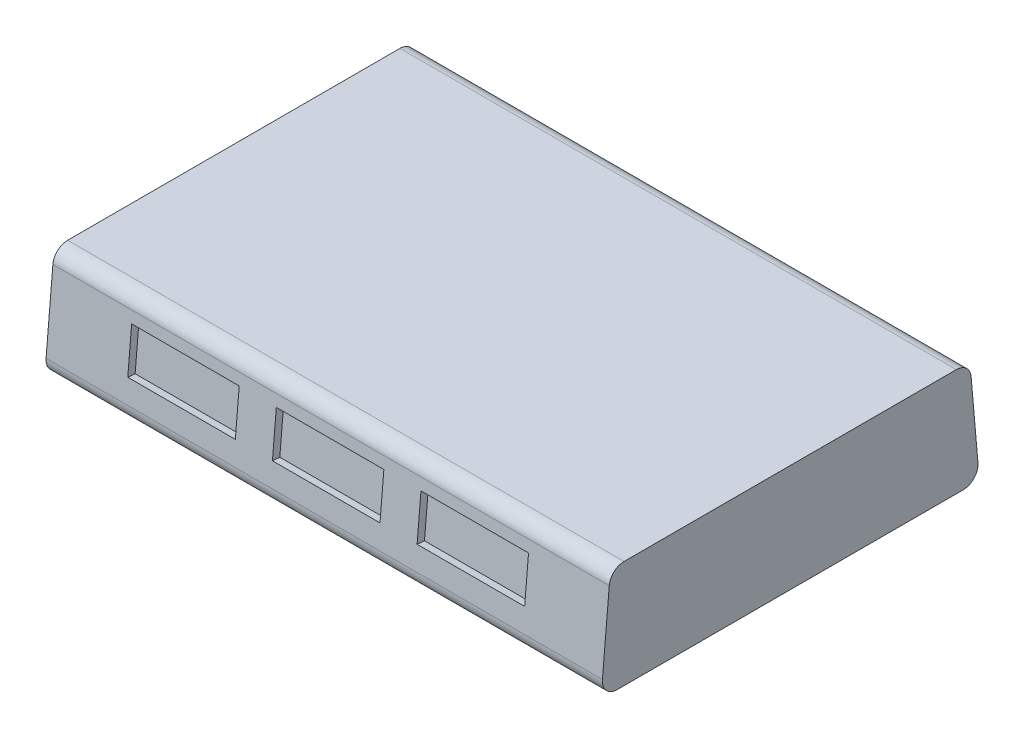
ISO-10303-21;
HEADER;
FILE_DESCRIPTION(('STEP AP214'),'2;1');
FILE_NAME('part.step','',(''),(''),'','','');
FILE_SCHEMA(('AUTOMOTIVE_DESIGN { 1 0 10303 214 1 1 1 1 }'));
ENDSEC;
DATA;
#1=APPLICATION_CONTEXT('core data for automotive mechanical design processes');
#2=APPLICATION_PROTOCOL_DEFINITION('international standard','automotive_design',2000,#1);
#3=PRODUCT_CONTEXT('',#1,'mechanical');
#4=PRODUCT('Part','Part','',(#3));
#5=PRODUCT_RELATED_PRODUCT_CATEGORY('part','',(#4));
#6=PRODUCT_DEFINITION_FORMATION('','',#4);
#7=PRODUCT_DEFINITION_CONTEXT('part definition',#1,'design');
#8=PRODUCT_DEFINITION('design','',#6,#7);
#9=PRODUCT_DEFINITION_SHAPE('','',#8);
#10=(LENGTH_UNIT() NAMED_UNIT(*) SI_UNIT(.MILLI.,.METRE.));
#11=(NAMED_UNIT(*) PLANE_ANGLE_UNIT() SI_UNIT($,.RADIAN.));
#12=(NAMED_UNIT(*) SI_UNIT($,.STERADIAN.) SOLID_ANGLE_UNIT());
#13=UNCERTAINTY_MEASURE_WITH_UNIT(LENGTH_MEASURE(1.E-05),#10,'distance_accuracy_value','');
#14=(GEOMETRIC_REPRESENTATION_CONTEXT(3) GLOBAL_UNCERTAINTY_ASSIGNED_CONTEXT((#13)) GLOBAL_UNIT_ASSIGNED_CONTEXT((#10,
#11,#12)) REPRESENTATION_CONTEXT('',''));
#15=CARTESIAN_POINT('',(0.,0.,0.));
#16=DIRECTION('',(0.,0.,1.));
#17=DIRECTION('',(1.,0.,0.));
#18=AXIS2_PLACEMENT_3D('',#15,#16,#17);
#19=CARTESIAN_POINT('',(37.5,5.24999999999999,-22.3987520308393));
#20=DIRECTION('',(-1.,0.,0.));
#21=DIRECTION('',(0.,0.,1.));
#22=AXIS2_PLACEMENT_3D('',#19,#20,#21);
#23=CYLINDRICAL_SURFACE('',#22,2.);
#24=CARTESIAN_POINT('',(-37.5,5.24999999999999,-22.3987520308393));
#25=DIRECTION('',(1.,0.,0.));
#26=DIRECTION('',(0.,0.,-1.));
#27=AXIS2_PLACEMENT_3D('',#24,#25,#26);
#28=CIRCLE('',#27,2.);
#29=CARTESIAN_POINT('',(-37.5,5.42431148549529,-24.3911414270228));
#30=VERTEX_POINT('',#29);
#31=CARTESIAN_POINT('',(-37.5,7.24999999999999,-22.3987520308393));
#32=VERTEX_POINT('',#31);
#33=EDGE_CURVE('E318',#30,#32,#28,.T.);
#34=ORIENTED_EDGE('',*,*,#33,.T.);
#35=DIRECTION('',(-1.,0.,0.));
#36=VECTOR('',#35,1.);
#37=CARTESIAN_POINT('',(37.5,7.24999999999999,-22.3987520308393));
#38=LINE('',#37,#36);
#39=CARTESIAN_POINT('',(37.5,7.24999999999999,-22.3987520308393));
#40=VERTEX_POINT('',#39);
#41=EDGE_CURVE('E11',#40,#32,#38,.T.);
#42=ORIENTED_EDGE('',*,*,#41,.F.);
#43=CARTESIAN_POINT('',(37.5,5.24999999999999,-22.3987520308393));
#44=DIRECTION('',(1.,0.,0.));
#45=DIRECTION('',(0.,0.,-1.));
#46=AXIS2_PLACEMENT_3D('',#43,#44,#45);
#47=CIRCLE('',#46,2.);
#48=CARTESIAN_POINT('',(37.5,5.42431148549529,-24.3911414270228));
#49=VERTEX_POINT('',#48);
#50=EDGE_CURVE('E387',#49,#40,#47,.T.);
#51=ORIENTED_EDGE('',*,*,#50,.F.);
#52=DIRECTION('',(-1.,0.,0.));
#53=VECTOR('',#52,1.);
#54=CARTESIAN_POINT('',(37.5,5.42431148549529,-24.3911414270228));
#55=LINE('',#54,#53);
#56=EDGE_CURVE('E405',#49,#30,#55,.T.);
#57=ORIENTED_EDGE('',*,*,#56,.T.);
#58=EDGE_LOOP('',(#34,#42,#51,#57));
#59=FACE_BOUND('',#58,.T.);
#60=ADVANCED_FACE('F38',(#59),#23,.T.);
#61=CARTESIAN_POINT('',(37.5,7.24999999999999,-22.3987520308393));
#62=DIRECTION('',(0.,-1.,0.));
#63=DIRECTION('',(0.,0.,-1.));
#64=AXIS2_PLACEMENT_3D('',#61,#62,#63);
#65=PLANE('',#64);
#66=DIRECTION('',(0.,0.,1.));
#67=VECTOR('',#66,1.);
#68=CARTESIAN_POINT('',(-37.5,7.24999999999999,-22.3987520308393));
#69=LINE('',#68,#67);
#70=CARTESIAN_POINT('',(-37.5,7.24999999999999,22.3987520308393));
#71=VERTEX_POINT('',#70);
#72=EDGE_CURVE('E408',#32,#71,#69,.T.);
#73=ORIENTED_EDGE('',*,*,#72,.T.);
#74=DIRECTION('',(-1.,0.,0.));
#75=VECTOR('',#74,1.);
#76=CARTESIAN_POINT('',(37.5,7.24999999999999,22.3987520308393));
#77=LINE('',#76,#75);
#78=CARTESIAN_POINT('',(37.5,7.24999999999999,22.3987520308393));
#79=VERTEX_POINT('',#78);
#80=EDGE_CURVE('E45',#79,#71,#77,.T.);
#81=ORIENTED_EDGE('',*,*,#80,.F.);
#82=DIRECTION('',(0.,0.,1.));
#83=VECTOR('',#82,1.);
#84=CARTESIAN_POINT('',(37.5,7.24999999999999,-22.3987520308393));
#85=LINE('',#84,#83);
#86=EDGE_CURVE('E390',#40,#79,#85,.T.);
#87=ORIENTED_EDGE('',*,*,#86,.F.);
#88=ORIENTED_EDGE('',*,*,#41,.T.);
#89=EDGE_LOOP('',(#73,#81,#87,#88));
#90=FACE_BOUND('',#89,.T.);
#91=ADVANCED_FACE('F465',(#90),#65,.F.);
#92=CARTESIAN_POINT('',(37.5,5.24999999999999,22.3987520308393));
#93=DIRECTION('',(-1.,0.,0.));
#94=DIRECTION('',(0.,0.,1.));
#95=AXIS2_PLACEMENT_3D('',#92,#93,#94);
#96=CYLINDRICAL_SURFACE('',#95,2.);
#97=CARTESIAN_POINT('',(-37.5,5.24999999999999,22.3987520308393));
#98=DIRECTION('',(1.,0.,0.));
#99=DIRECTION('',(0.,0.,1.));
#100=AXIS2_PLACEMENT_3D('',#97,#98,#99);
#101=CIRCLE('',#100,2.);
#102=CARTESIAN_POINT('',(-37.5,5.42431148549529,24.3911414270228));
#103=VERTEX_POINT('',#102);
#104=EDGE_CURVE('E410',#71,#103,#101,.T.);
#105=ORIENTED_EDGE('',*,*,#104,.T.);
#106=DIRECTION('',(-1.,0.,0.));
#107=VECTOR('',#106,1.);
#108=CARTESIAN_POINT('',(37.5,5.42431148549529,24.3911414270228));
#109=LINE('',#108,#107);
#110=CARTESIAN_POINT('',(37.5,5.42431148549529,24.3911414270228));
#111=VERTEX_POINT('',#110);
#112=EDGE_CURVE('E435',#111,#103,#109,.T.);
#113=ORIENTED_EDGE('',*,*,#112,.F.);
#114=CARTESIAN_POINT('',(37.5,5.24999999999999,22.3987520308393));
#115=DIRECTION('',(1.,0.,0.));
#116=DIRECTION('',(0.,0.,1.));
#117=AXIS2_PLACEMENT_3D('',#114,#115,#116);
#118=CIRCLE('',#117,2.);
#119=EDGE_CURVE('E393',#79,#111,#118,.T.);
#120=ORIENTED_EDGE('',*,*,#119,.F.);
#121=ORIENTED_EDGE('',*,*,#80,.T.);
#122=EDGE_LOOP('',(#105,#113,#120,#121));
#123=FACE_BOUND('',#122,.T.);
#124=ADVANCED_FACE('F442',(#123),#96,.T.);
#125=CARTESIAN_POINT('',(37.5,5.42431148549529,24.3911414270228));
#126=DIRECTION('',(0.,-0.0871557427476516,-0.996194698091746));
#127=DIRECTION('',(0.,0.996194698091746,-0.0871557427476516));
#128=AXIS2_PLACEMENT_3D('',#125,#126,#127);
#129=PLANE('',#128);
#130=DIRECTION('',(1.,0.,0.));
#131=VECTOR('',#130,1.);
#132=CARTESIAN_POINT('',(-26.75,-2.0471487501928,25.0448094976302));
#133=LINE('',#132,#131);
#134=CARTESIAN_POINT('',(-26.75,-2.0471487501928,25.0448094976302));
#135=VERTEX_POINT('',#134);
#136=CARTESIAN_POINT('',(-12.25,-2.0471487501928,25.0448094976302));
#137=VERTEX_POINT('',#136);
#138=EDGE_CURVE('E307',#135,#137,#133,.T.);
#139=ORIENTED_EDGE('',*,*,#138,.F.);
#140=DIRECTION('',(0.,-0.996194698091746,0.0871557427476518));
#141=VECTOR('',#140,1.);
#142=CARTESIAN_POINT('',(-26.75,3.93001943835767,24.5218750411443));
#143=LINE('',#142,#141);
#144=CARTESIAN_POINT('',(-26.75,3.93001943835767,24.5218750411443));
#145=VERTEX_POINT('',#144);
#146=EDGE_CURVE('E305',#145,#135,#143,.T.);
#147=ORIENTED_EDGE('',*,*,#146,.F.);
#148=DIRECTION('',(-1.,0.,0.));
#149=VECTOR('',#148,1.);
#150=CARTESIAN_POINT('',(-26.75,3.93001943835767,24.5218750411443));
#151=LINE('',#150,#149);
#152=CARTESIAN_POINT('',(-12.25,3.93001943835767,24.5218750411443));
#153=VERTEX_POINT('',#152);
#154=EDGE_CURVE('E295',#153,#145,#151,.T.);
#155=ORIENTED_EDGE('',*,*,#154,.F.);
#156=DIRECTION('',(0.,0.996194698091746,-0.0871557427476518));
#157=VECTOR('',#156,1.);
#158=CARTESIAN_POINT('',(-12.25,3.93001943835767,24.5218750411443));
#159=LINE('',#158,#157);
#160=EDGE_CURVE('E311',#137,#153,#159,.T.);
#161=ORIENTED_EDGE('',*,*,#160,.F.);
#162=EDGE_LOOP('',(#139,#147,#155,#161));
#163=FACE_BOUND('',#162,.T.);
#164=DIRECTION('',(1.,0.,0.));
#165=VECTOR('',#164,1.);
#166=CARTESIAN_POINT('',(-7.25,-2.0471487501928,25.0448094976302));
#167=LINE('',#166,#165);
#168=CARTESIAN_POINT('',(-7.25,-2.0471487501928,25.0448094976302));
#169=VERTEX_POINT('',#168);
#170=CARTESIAN_POINT('',(7.25,-2.0471487501928,25.0448094976302));
#171=VERTEX_POINT('',#170);
#172=EDGE_CURVE('E341',#169,#171,#167,.T.);
#173=ORIENTED_EDGE('',*,*,#172,.F.);
#174=DIRECTION('',(0.,-0.996194698091746,0.0871557427476518));
#175=VECTOR('',#174,1.);
#176=CARTESIAN_POINT('',(-7.25,3.93001943835767,24.5218750411443));
#177=LINE('',#176,#175);
#178=CARTESIAN_POINT('',(-7.25,3.93001943835767,24.5218750411443));
#179=VERTEX_POINT('',#178);
#180=EDGE_CURVE('E339',#179,#169,#177,.T.);
#181=ORIENTED_EDGE('',*,*,#180,.F.);
#182=DIRECTION('',(-1.,0.,0.));
#183=VECTOR('',#182,1.);
#184=CARTESIAN_POINT('',(-7.25,3.93001943835767,24.5218750411443));
#185=LINE('',#184,#183);
#186=CARTESIAN_POINT('',(7.25,3.93001943835767,24.5218750411443));
#187=VERTEX_POINT('',#186);
#188=EDGE_CURVE('E329',#187,#179,#185,.T.);
#189=ORIENTED_EDGE('',*,*,#188,.F.);
#190=DIRECTION('',(0.,0.996194698091746,-0.0871557427476518));
#191=VECTOR('',#190,1.);
#192=CARTESIAN_POINT('',(7.25,3.93001943835767,24.5218750411443));
#193=LINE('',#192,#191);
#194=EDGE_CURVE('E345',#171,#187,#193,.T.);
#195=ORIENTED_EDGE('',*,*,#194,.F.);
#196=EDGE_LOOP('',(#173,#181,#189,#195));
#197=FACE_BOUND('',#196,.T.);
#198=DIRECTION('',(1.,0.,0.));
#199=VECTOR('',#198,1.);
#200=CARTESIAN_POINT('',(12.25,-2.0471487501928,25.0448094976302));
#201=LINE('',#200,#199);
#202=CARTESIAN_POINT('',(12.25,-2.0471487501928,25.0448094976302));
#203=VERTEX_POINT('',#202);
#204=CARTESIAN_POINT('',(26.75,-2.0471487501928,25.0448094976302));
#205=VERTEX_POINT('',#204);
#206=EDGE_CURVE('E372',#203,#205,#201,.T.);
#207=ORIENTED_EDGE('',*,*,#206,.F.);
#208=DIRECTION('',(0.,-0.996194698091746,0.0871557427476518));
#209=VECTOR('',#208,1.);
#210=CARTESIAN_POINT('',(12.25,3.93001943835767,24.5218750411443));
#211=LINE('',#210,#209);
#212=CARTESIAN_POINT('',(12.25,3.93001943835767,24.5218750411443));
#213=VERTEX_POINT('',#212);
#214=EDGE_CURVE('E258',#213,#203,#211,.T.);
#215=ORIENTED_EDGE('',*,*,#214,.F.);
#216=DIRECTION('',(-1.,0.,0.));
#217=VECTOR('',#216,1.);
#218=CARTESIAN_POINT('',(12.25,3.93001943835767,24.5218750411443));
#219=LINE('',#218,#217);
#220=CARTESIAN_POINT('',(26.75,3.93001943835767,24.5218750411443));
#221=VERTEX_POINT('',#220);
#222=EDGE_CURVE('E361',#221,#213,#219,.T.);
#223=ORIENTED_EDGE('',*,*,#222,.F.);
#224=DIRECTION('',(0.,0.996194698091746,-0.0871557427476518));
#225=VECTOR('',#224,1.);
#226=CARTESIAN_POINT('',(26.75,3.93001943835767,24.5218750411443));
#227=LINE('',#226,#225);
#228=EDGE_CURVE('E375',#205,#221,#227,.T.);
#229=ORIENTED_EDGE('',*,*,#228,.F.);
#230=EDGE_LOOP('',(#207,#215,#223,#229));
#231=FACE_BOUND('',#230,.T.);
#232=DIRECTION('',(0.,-0.996194698091746,0.0871557427476517));
#233=VECTOR('',#232,1.);
#234=CARTESIAN_POINT('',(-37.5,5.42431148549529,24.3911414270228));
#235=LINE('',#234,#233);
#236=CARTESIAN_POINT('',(-37.5,-5.07568851450467,25.309772394045));
#237=VERTEX_POINT('',#236);
#238=EDGE_CURVE('E412',#103,#237,#235,.T.);
#239=ORIENTED_EDGE('',*,*,#238,.T.);
#240=DIRECTION('',(-1.,0.,0.));
#241=VECTOR('',#240,1.);
#242=CARTESIAN_POINT('',(37.5,-5.07568851450467,25.309772394045));
#243=LINE('',#242,#241);
#244=CARTESIAN_POINT('',(37.5,-5.07568851450467,25.309772394045));
#245=VERTEX_POINT('',#244);
#246=EDGE_CURVE('E432',#245,#237,#243,.T.);
#247=ORIENTED_EDGE('',*,*,#246,.F.);
#248=DIRECTION('',(0.,-0.996194698091746,0.0871557427476517));
#249=VECTOR('',#248,1.);
#250=CARTESIAN_POINT('',(37.5,5.42431148549529,24.3911414270228));
#251=LINE('',#250,#249);
#252=EDGE_CURVE('E395',#111,#245,#251,.T.);
#253=ORIENTED_EDGE('',*,*,#252,.F.);
#254=ORIENTED_EDGE('',*,*,#112,.T.);
#255=EDGE_LOOP('',(#239,#247,#253,#254));
#256=FACE_BOUND('',#255,.T.);
#257=ADVANCED_FACE('F453',(#163,#197,#231,#256),#129,.F.);
#258=CARTESIAN_POINT('',(37.5,-5.24999999999999,23.3173829978615));
#259=DIRECTION('',(-1.,0.,0.));
#260=DIRECTION('',(0.,0.,1.));
#261=AXIS2_PLACEMENT_3D('',#258,#259,#260);
#262=CYLINDRICAL_SURFACE('',#261,2.);
#263=CARTESIAN_POINT('',(-37.5,-5.24999999999999,23.3173829978615));
#264=DIRECTION('',(1.,0.,0.));
#265=DIRECTION('',(0.,0.,-1.));
#266=AXIS2_PLACEMENT_3D('',#263,#264,#265);
#267=CIRCLE('',#266,2.);
#268=CARTESIAN_POINT('',(-37.5,-7.24999999999999,23.3173829978615));
#269=VERTEX_POINT('',#268);
#270=EDGE_CURVE('E414',#237,#269,#267,.T.);
#271=ORIENTED_EDGE('',*,*,#270,.T.);
#272=DIRECTION('',(-1.,0.,0.));
#273=VECTOR('',#272,1.);
#274=CARTESIAN_POINT('',(37.5,-7.24999999999999,23.3173829978615));
#275=LINE('',#274,#273);
#276=CARTESIAN_POINT('',(37.5,-7.24999999999999,23.3173829978615));
#277=VERTEX_POINT('',#276);
#278=EDGE_CURVE('E429',#277,#269,#275,.T.);
#279=ORIENTED_EDGE('',*,*,#278,.F.);
#280=CARTESIAN_POINT('',(37.5,-5.24999999999999,23.3173829978615));
#281=DIRECTION('',(1.,0.,0.));
#282=DIRECTION('',(0.,0.,-1.));
#283=AXIS2_PLACEMENT_3D('',#280,#281,#282);
#284=CIRCLE('',#283,2.);
#285=EDGE_CURVE('E397',#245,#277,#284,.T.);
#286=ORIENTED_EDGE('',*,*,#285,.F.);
#287=ORIENTED_EDGE('',*,*,#246,.T.);
#288=EDGE_LOOP('',(#271,#279,#286,#287));
#289=FACE_BOUND('',#288,.T.);
#290=ADVANCED_FACE('F457',(#289),#262,.T.);
#291=CARTESIAN_POINT('',(37.5,-7.24999999999999,23.3173829978615));
#292=DIRECTION('',(0.,1.,0.));
#293=DIRECTION('',(0.,0.,1.));
#294=AXIS2_PLACEMENT_3D('',#291,#292,#293);
#295=PLANE('',#294);
#296=DIRECTION('',(0.,0.,-1.));
#297=VECTOR('',#296,1.);
#298=CARTESIAN_POINT('',(-37.5,-7.24999999999999,23.3173829978615));
#299=LINE('',#298,#297);
#300=CARTESIAN_POINT('',(-37.5,-7.24999999999999,-23.3173829978615));
#301=VERTEX_POINT('',#300);
#302=EDGE_CURVE('E416',#269,#301,#299,.T.);
#303=ORIENTED_EDGE('',*,*,#302,.T.);
#304=DIRECTION('',(-1.,0.,0.));
#305=VECTOR('',#304,1.);
#306=CARTESIAN_POINT('',(37.5,-7.24999999999999,-23.3173829978615));
#307=LINE('',#306,#305);
#308=CARTESIAN_POINT('',(37.5,-7.24999999999999,-23.3173829978615));
#309=VERTEX_POINT('',#308);
#310=EDGE_CURVE('E426',#309,#301,#307,.T.);
#311=ORIENTED_EDGE('',*,*,#310,.F.);
#312=DIRECTION('',(0.,0.,-1.));
#313=VECTOR('',#312,1.);
#314=CARTESIAN_POINT('',(37.5,-7.24999999999999,23.3173829978615));
#315=LINE('',#314,#313);
#316=EDGE_CURVE('E399',#277,#309,#315,.T.);
#317=ORIENTED_EDGE('',*,*,#316,.F.);
#318=ORIENTED_EDGE('',*,*,#278,.T.);
#319=EDGE_LOOP('',(#303,#311,#317,#318));
#320=FACE_BOUND('',#319,.T.);
#321=ADVANCED_FACE('F478',(#320),#295,.F.);
#322=CARTESIAN_POINT('',(37.5,-5.24999999999999,-23.3173829978615));
#323=DIRECTION('',(-1.,0.,0.));
#324=DIRECTION('',(0.,0.,1.));
#325=AXIS2_PLACEMENT_3D('',#322,#323,#324);
#326=CYLINDRICAL_SURFACE('',#325,2.);
#327=CARTESIAN_POINT('',(-37.5,-5.24999999999999,-23.3173829978615));
#328=DIRECTION('',(1.,0.,0.));
#329=DIRECTION('',(0.,0.,-1.));
#330=AXIS2_PLACEMENT_3D('',#327,#328,#329);
#331=CIRCLE('',#330,2.);
#332=CARTESIAN_POINT('',(-37.5,-5.07568851450467,-25.309772394045));
#333=VERTEX_POINT('',#332);
#334=EDGE_CURVE('E418',#301,#333,#331,.T.);
#335=ORIENTED_EDGE('',*,*,#334,.T.);
#336=DIRECTION('',(-1.,0.,0.));
#337=VECTOR('',#336,1.);
#338=CARTESIAN_POINT('',(37.5,-5.07568851450467,-25.309772394045));
#339=LINE('',#338,#337);
#340=CARTESIAN_POINT('',(37.5,-5.07568851450467,-25.309772394045));
#341=VERTEX_POINT('',#340);
#342=EDGE_CURVE('E423',#341,#333,#339,.T.);
#343=ORIENTED_EDGE('',*,*,#342,.F.);
#344=CARTESIAN_POINT('',(37.5,-5.24999999999999,-23.3173829978615));
#345=DIRECTION('',(1.,0.,0.));
#346=DIRECTION('',(0.,0.,-1.));
#347=AXIS2_PLACEMENT_3D('',#344,#345,#346);
#348=CIRCLE('',#347,2.);
#349=EDGE_CURVE('E401',#309,#341,#348,.T.);
#350=ORIENTED_EDGE('',*,*,#349,.F.);
#351=ORIENTED_EDGE('',*,*,#310,.T.);
#352=EDGE_LOOP('',(#335,#343,#350,#351));
#353=FACE_BOUND('',#352,.T.);
#354=ADVANCED_FACE('F476',(#353),#326,.T.);
#355=CARTESIAN_POINT('',(37.5,-5.07568851450467,-25.309772394045));
#356=DIRECTION('',(0.,-0.0871557427476517,0.996194698091746));
#357=DIRECTION('',(0.,-0.996194698091746,-0.0871557427476517));
#358=AXIS2_PLACEMENT_3D('',#355,#356,#357);
#359=PLANE('',#358);
#360=DIRECTION('',(-1.,0.,0.));
#361=VECTOR('',#360,1.);
#362=CARTESIAN_POINT('',(-11.75,-1.05095405210106,-24.9576537548826));
#363=LINE('',#362,#361);
#364=CARTESIAN_POINT('',(-11.75,-1.05095405210106,-24.9576537548826));
#365=VERTEX_POINT('',#364);
#366=CARTESIAN_POINT('',(-26.75,-1.05095405210106,-24.9576537548826));
#367=VERTEX_POINT('',#366);
#368=EDGE_CURVE('E251',#365,#367,#363,.T.);
#369=ORIENTED_EDGE('',*,*,#368,.F.);
#370=DIRECTION('',(0.,-0.996194698091746,-0.0871557427476518));
#371=VECTOR('',#370,1.);
#372=CARTESIAN_POINT('',(-11.75,0.941435344082428,-24.7833422693873));
#373=LINE('',#372,#371);
#374=CARTESIAN_POINT('',(-11.75,0.941435344082428,-24.7833422693873));
#375=VERTEX_POINT('',#374);
#376=EDGE_CURVE('E52',#375,#365,#373,.T.);
#377=ORIENTED_EDGE('',*,*,#376,.F.);
#378=DIRECTION('',(1.,0.,0.));
#379=VECTOR('',#378,1.);
#380=CARTESIAN_POINT('',(-11.75,0.941435344082428,-24.7833422693873));
#381=LINE('',#380,#379);
#382=CARTESIAN_POINT('',(-26.75,0.941435344082428,-24.7833422693873));
#383=VERTEX_POINT('',#382);
#384=EDGE_CURVE('E242',#383,#375,#381,.T.);
#385=ORIENTED_EDGE('',*,*,#384,.F.);
#386=DIRECTION('',(0.,0.996194698091746,0.0871557427476518));
#387=VECTOR('',#386,1.);
#388=CARTESIAN_POINT('',(-26.75,0.941435344082428,-24.7833422693873));
#389=LINE('',#388,#387);
#390=EDGE_CURVE('E245',#367,#383,#389,.T.);
#391=ORIENTED_EDGE('',*,*,#390,.F.);
#392=EDGE_LOOP('',(#369,#377,#385,#391));
#393=FACE_BOUND('',#392,.T.);
#394=DIRECTION('',(-1.,0.,0.));
#395=VECTOR('',#394,1.);
#396=CARTESIAN_POINT('',(17.5,-3.31236995782581,-25.1555020101507));
#397=LINE('',#396,#395);
#398=CARTESIAN_POINT('',(17.5,-3.31236995782581,-25.1555020101507));
#399=VERTEX_POINT('',#398);
#400=CARTESIAN_POINT('',(8.5,-3.31236995782581,-25.1555020101507));
#401=VERTEX_POINT('',#400);
#402=EDGE_CURVE('E277',#399,#401,#397,.T.);
#403=ORIENTED_EDGE('',*,*,#402,.F.);
#404=DIRECTION('',(0.,-0.996194698091746,-0.0871557427476515));
#405=VECTOR('',#404,1.);
#406=CARTESIAN_POINT('',(17.5,3.66099292881642,-24.5454118109171));
#407=LINE('',#406,#405);
#408=CARTESIAN_POINT('',(17.5,3.66099292881642,-24.5454118109171));
#409=VERTEX_POINT('',#408);
#410=EDGE_CURVE('E60',#409,#399,#407,.T.);
#411=ORIENTED_EDGE('',*,*,#410,.F.);
#412=DIRECTION('',(1.,0.,0.));
#413=VECTOR('',#412,1.);
#414=CARTESIAN_POINT('',(17.5,3.66099292881642,-24.5454118109171));
#415=LINE('',#414,#413);
#416=CARTESIAN_POINT('',(8.5,3.66099292881642,-24.5454118109171));
#417=VERTEX_POINT('',#416);
#418=EDGE_CURVE('E266',#417,#409,#415,.T.);
#419=ORIENTED_EDGE('',*,*,#418,.F.);
#420=DIRECTION('',(0.,0.996194698091746,0.0871557427476515));
#421=VECTOR('',#420,1.);
#422=CARTESIAN_POINT('',(8.5,3.66099292881642,-24.5454118109171));
#423=LINE('',#422,#421);
#424=EDGE_CURVE('E280',#401,#417,#423,.T.);
#425=ORIENTED_EDGE('',*,*,#424,.F.);
#426=EDGE_LOOP('',(#403,#411,#419,#425));
#427=FACE_BOUND('',#426,.T.);
#428=DIRECTION('',(0.,0.996194698091746,0.0871557427476517));
#429=VECTOR('',#428,1.);
#430=CARTESIAN_POINT('',(-37.5,-5.07568851450467,-25.309772394045));
#431=LINE('',#430,#429);
#432=EDGE_CURVE('E391',#333,#30,#431,.T.);
#433=ORIENTED_EDGE('',*,*,#432,.T.);
#434=ORIENTED_EDGE('',*,*,#56,.F.);
#435=DIRECTION('',(0.,0.996194698091746,0.0871557427476517));
#436=VECTOR('',#435,1.);
#437=CARTESIAN_POINT('',(37.5,-5.07568851450467,-25.309772394045));
#438=LINE('',#437,#436);
#439=EDGE_CURVE('E403',#341,#49,#438,.T.);
#440=ORIENTED_EDGE('',*,*,#439,.F.);
#441=ORIENTED_EDGE('',*,*,#342,.T.);
#442=EDGE_LOOP('',(#433,#434,#440,#441));
#443=FACE_BOUND('',#442,.T.);
#444=ADVANCED_FACE('F471',(#393,#427,#443),#359,.F.);
#445=CARTESIAN_POINT('',(37.5,5.24999999999999,-22.3987520308393));
#446=DIRECTION('',(1.,0.,0.));
#447=DIRECTION('',(0.,0.,-1.));
#448=AXIS2_PLACEMENT_3D('',#445,#446,#447);
#449=PLANE('',#448);
#450=ORIENTED_EDGE('',*,*,#50,.T.);
#451=ORIENTED_EDGE('',*,*,#86,.T.);
#452=ORIENTED_EDGE('',*,*,#119,.T.);
#453=ORIENTED_EDGE('',*,*,#252,.T.);
#454=ORIENTED_EDGE('',*,*,#285,.T.);
#455=ORIENTED_EDGE('',*,*,#316,.T.);
#456=ORIENTED_EDGE('',*,*,#349,.T.);
#457=ORIENTED_EDGE('',*,*,#439,.T.);
#458=EDGE_LOOP('',(#450,#451,#452,#453,#454,#455,#456,#457));
#459=FACE_BOUND('',#458,.T.);
#460=ADVANCED_FACE('F461',(#459),#449,.T.);
#461=CARTESIAN_POINT('',(-37.5,5.24999999999999,-22.3987520308393));
#462=DIRECTION('',(1.,0.,0.));
#463=DIRECTION('',(0.,0.,-1.));
#464=AXIS2_PLACEMENT_3D('',#461,#462,#463);
#465=PLANE('',#464);
#466=ORIENTED_EDGE('',*,*,#33,.F.);
#467=ORIENTED_EDGE('',*,*,#432,.F.);
#468=ORIENTED_EDGE('',*,*,#334,.F.);
#469=ORIENTED_EDGE('',*,*,#302,.F.);
#470=ORIENTED_EDGE('',*,*,#270,.F.);
#471=ORIENTED_EDGE('',*,*,#238,.F.);
#472=ORIENTED_EDGE('',*,*,#104,.F.);
#473=ORIENTED_EDGE('',*,*,#72,.F.);
#474=EDGE_LOOP('',(#466,#467,#468,#469,#470,#471,#472,#473));
#475=FACE_BOUND('',#474,.T.);
#476=ADVANCED_FACE('F448',(#475),#465,.F.);
#477=CARTESIAN_POINT('',(12.25,3.84286369561002,23.5256803430526));
#478=DIRECTION('',(-1.,0.,0.));
#479=DIRECTION('',(0.,0.,1.));
#480=AXIS2_PLACEMENT_3D('',#477,#478,#479);
#481=PLANE('',#480);
#482=ORIENTED_EDGE('',*,*,#214,.T.);
#483=DIRECTION('',(0.,0.0871557427476516,0.996194698091746));
#484=VECTOR('',#483,1.);
#485=CARTESIAN_POINT('',(12.25,-2.13430449294046,24.0486147995385));
#486=LINE('',#485,#484);
#487=CARTESIAN_POINT('',(12.25,-2.13430449294046,24.0486147995385));
#488=VERTEX_POINT('',#487);
#489=EDGE_CURVE('E370',#488,#203,#486,.T.);
#490=ORIENTED_EDGE('',*,*,#489,.F.);
#491=DIRECTION('',(0.,-0.996194698091746,0.0871557427476518));
#492=VECTOR('',#491,1.);
#493=CARTESIAN_POINT('',(12.25,3.84286369561002,23.5256803430526));
#494=LINE('',#493,#492);
#495=CARTESIAN_POINT('',(12.25,3.84286369561002,23.5256803430526));
#496=VERTEX_POINT('',#495);
#497=EDGE_CURVE('E357',#496,#488,#494,.T.);
#498=ORIENTED_EDGE('',*,*,#497,.F.);
#499=DIRECTION('',(0.,0.0871557427476516,0.996194698091746));
#500=VECTOR('',#499,1.);
#501=CARTESIAN_POINT('',(12.25,3.84286369561002,23.5256803430526));
#502=LINE('',#501,#500);
#503=EDGE_CURVE('E342',#496,#213,#502,.T.);
#504=ORIENTED_EDGE('',*,*,#503,.T.);
#505=EDGE_LOOP('',(#482,#490,#498,#504));
#506=FACE_BOUND('',#505,.T.);
#507=ADVANCED_FACE('F518',(#506),#481,.F.);
#508=CARTESIAN_POINT('',(12.25,3.84286369561002,23.5256803430526));
#509=DIRECTION('',(0.,0.996194698091746,-0.0871557427476516));
#510=DIRECTION('',(0.,0.0871557427476517,0.996194698091746));
#511=AXIS2_PLACEMENT_3D('',#508,#509,#510);
#512=PLANE('',#511);
#513=ORIENTED_EDGE('',*,*,#222,.T.);
#514=ORIENTED_EDGE('',*,*,#503,.F.);
#515=DIRECTION('',(-1.,0.,0.));
#516=VECTOR('',#515,1.);
#517=CARTESIAN_POINT('',(12.25,3.84286369561002,23.5256803430526));
#518=LINE('',#517,#516);
#519=CARTESIAN_POINT('',(26.75,3.84286369561002,23.5256803430526));
#520=VERTEX_POINT('',#519);
#521=EDGE_CURVE('E367',#520,#496,#518,.T.);
#522=ORIENTED_EDGE('',*,*,#521,.F.);
#523=DIRECTION('',(0.,0.0871557427476516,0.996194698091746));
#524=VECTOR('',#523,1.);
#525=CARTESIAN_POINT('',(26.75,3.84286369561002,23.5256803430526));
#526=LINE('',#525,#524);
#527=EDGE_CURVE('E381',#520,#221,#526,.T.);
#528=ORIENTED_EDGE('',*,*,#527,.T.);
#529=EDGE_LOOP('',(#513,#514,#522,#528));
#530=FACE_BOUND('',#529,.T.);
#531=ADVANCED_FACE('F521',(#530),#512,.F.);
#532=CARTESIAN_POINT('',(26.75,3.84286369561002,23.5256803430526));
#533=DIRECTION('',(1.,0.,0.));
#534=DIRECTION('',(0.,1.,0.));
#535=AXIS2_PLACEMENT_3D('',#532,#533,#534);
#536=PLANE('',#535);
#537=ORIENTED_EDGE('',*,*,#228,.T.);
#538=ORIENTED_EDGE('',*,*,#527,.F.);
#539=DIRECTION('',(0.,0.996194698091746,-0.0871557427476518));
#540=VECTOR('',#539,1.);
#541=CARTESIAN_POINT('',(26.75,3.84286369561002,23.5256803430526));
#542=LINE('',#541,#540);
#543=CARTESIAN_POINT('',(26.75,-2.13430449294046,24.0486147995385));
#544=VERTEX_POINT('',#543);
#545=EDGE_CURVE('E364',#544,#520,#542,.T.);
#546=ORIENTED_EDGE('',*,*,#545,.F.);
#547=DIRECTION('',(0.,0.0871557427476516,0.996194698091746));
#548=VECTOR('',#547,1.);
#549=CARTESIAN_POINT('',(26.75,-2.13430449294046,24.0486147995385));
#550=LINE('',#549,#548);
#551=EDGE_CURVE('E383',#544,#205,#550,.T.);
#552=ORIENTED_EDGE('',*,*,#551,.T.);
#553=EDGE_LOOP('',(#537,#538,#546,#552));
#554=FACE_BOUND('',#553,.T.);
#555=ADVANCED_FACE('F523',(#554),#536,.F.);
#556=CARTESIAN_POINT('',(12.25,-2.13430449294046,24.0486147995385));
#557=DIRECTION('',(0.,-0.996194698091746,0.0871557427476516));
#558=DIRECTION('',(0.,-0.0871557427476517,-0.996194698091746));
#559=AXIS2_PLACEMENT_3D('',#556,#557,#558);
#560=PLANE('',#559);
#561=ORIENTED_EDGE('',*,*,#206,.T.);
#562=ORIENTED_EDGE('',*,*,#551,.F.);
#563=DIRECTION('',(1.,0.,0.));
#564=VECTOR('',#563,1.);
#565=CARTESIAN_POINT('',(12.25,-2.13430449294046,24.0486147995385));
#566=LINE('',#565,#564);
#567=EDGE_CURVE('E360',#488,#544,#566,.T.);
#568=ORIENTED_EDGE('',*,*,#567,.F.);
#569=ORIENTED_EDGE('',*,*,#489,.T.);
#570=EDGE_LOOP('',(#561,#562,#568,#569));
#571=FACE_BOUND('',#570,.T.);
#572=ADVANCED_FACE('F513',(#571),#560,.F.);
#573=CARTESIAN_POINT('',(0.,2.07178662717481,23.6806295087714));
#574=DIRECTION('',(0.,0.0871557427476518,0.996194698091746));
#575=DIRECTION('',(0.,-0.996194698091746,0.0871557427476518));
#576=AXIS2_PLACEMENT_3D('',#573,#574,#575);
#577=PLANE('',#576);
#578=ORIENTED_EDGE('',*,*,#497,.T.);
#579=ORIENTED_EDGE('',*,*,#567,.T.);
#580=ORIENTED_EDGE('',*,*,#545,.T.);
#581=ORIENTED_EDGE('',*,*,#521,.T.);
#582=EDGE_LOOP('',(#578,#579,#580,#581));
#583=FACE_BOUND('',#582,.T.);
#584=ADVANCED_FACE('F525',(#583),#577,.T.);
#585=CARTESIAN_POINT('',(-7.25,3.84286369561002,23.5256803430526));
#586=DIRECTION('',(-1.,0.,0.));
#587=DIRECTION('',(0.,-1.,0.));
#588=AXIS2_PLACEMENT_3D('',#585,#586,#587);
#589=PLANE('',#588);
#590=ORIENTED_EDGE('',*,*,#180,.T.);
#591=DIRECTION('',(0.,0.0871557427476516,0.996194698091746));
#592=VECTOR('',#591,1.);
#593=CARTESIAN_POINT('',(-7.25,-2.13430449294046,24.0486147995385));
#594=LINE('',#593,#592);
#595=CARTESIAN_POINT('',(-7.25,-2.13430449294046,24.0486147995385));
#596=VERTEX_POINT('',#595);
#597=EDGE_CURVE('E338',#596,#169,#594,.T.);
#598=ORIENTED_EDGE('',*,*,#597,.F.);
#599=DIRECTION('',(0.,-0.996194698091746,0.0871557427476518));
#600=VECTOR('',#599,1.);
#601=CARTESIAN_POINT('',(-7.25,3.84286369561002,23.5256803430526));
#602=LINE('',#601,#600);
#603=CARTESIAN_POINT('',(-7.25,3.84286369561002,23.5256803430526));
#604=VERTEX_POINT('',#603);
#605=EDGE_CURVE('E325',#604,#596,#602,.T.);
#606=ORIENTED_EDGE('',*,*,#605,.F.);
#607=DIRECTION('',(0.,0.0871557427476516,0.996194698091746));
#608=VECTOR('',#607,1.);
#609=CARTESIAN_POINT('',(-7.25,3.84286369561002,23.5256803430526));
#610=LINE('',#609,#608);
#611=EDGE_CURVE('E308',#604,#179,#610,.T.);
#612=ORIENTED_EDGE('',*,*,#611,.T.);
#613=EDGE_LOOP('',(#590,#598,#606,#612));
#614=FACE_BOUND('',#613,.T.);
#615=ADVANCED_FACE('F527',(#614),#589,.F.);
#616=CARTESIAN_POINT('',(-7.25,3.84286369561002,23.5256803430526));
#617=DIRECTION('',(0.,0.996194698091746,-0.0871557427476516));
#618=DIRECTION('',(0.,0.0871557427476517,0.996194698091746));
#619=AXIS2_PLACEMENT_3D('',#616,#617,#618);
#620=PLANE('',#619);
#621=ORIENTED_EDGE('',*,*,#188,.T.);
#622=ORIENTED_EDGE('',*,*,#611,.F.);
#623=DIRECTION('',(-1.,0.,0.));
#624=VECTOR('',#623,1.);
#625=CARTESIAN_POINT('',(-7.25,3.84286369561002,23.5256803430526));
#626=LINE('',#625,#624);
#627=CARTESIAN_POINT('',(7.25,3.84286369561002,23.5256803430526));
#628=VERTEX_POINT('',#627);
#629=EDGE_CURVE('E335',#628,#604,#626,.T.);
#630=ORIENTED_EDGE('',*,*,#629,.F.);
#631=DIRECTION('',(0.,0.0871557427476516,0.996194698091746));
#632=VECTOR('',#631,1.);
#633=CARTESIAN_POINT('',(7.25,3.84286369561002,23.5256803430526));
#634=LINE('',#633,#632);
#635=EDGE_CURVE('E351',#628,#187,#634,.T.);
#636=ORIENTED_EDGE('',*,*,#635,.T.);
#637=EDGE_LOOP('',(#621,#622,#630,#636));
#638=FACE_BOUND('',#637,.T.);
#639=ADVANCED_FACE('F533',(#638),#620,.F.);
#640=CARTESIAN_POINT('',(7.25,3.84286369561002,23.5256803430526));
#641=DIRECTION('',(1.,0.,0.));
#642=DIRECTION('',(0.,1.,0.));
#643=AXIS2_PLACEMENT_3D('',#640,#641,#642);
#644=PLANE('',#643);
#645=ORIENTED_EDGE('',*,*,#194,.T.);
#646=ORIENTED_EDGE('',*,*,#635,.F.);
#647=DIRECTION('',(0.,0.996194698091746,-0.0871557427476518));
#648=VECTOR('',#647,1.);
#649=CARTESIAN_POINT('',(7.25,3.84286369561002,23.5256803430526));
#650=LINE('',#649,#648);
#651=CARTESIAN_POINT('',(7.25,-2.13430449294046,24.0486147995385));
#652=VERTEX_POINT('',#651);
#653=EDGE_CURVE('E332',#652,#628,#650,.T.);
#654=ORIENTED_EDGE('',*,*,#653,.F.);
#655=DIRECTION('',(0.,0.0871557427476516,0.996194698091746));
#656=VECTOR('',#655,1.);
#657=CARTESIAN_POINT('',(7.25,-2.13430449294046,24.0486147995385));
#658=LINE('',#657,#656);
#659=EDGE_CURVE('E353',#652,#171,#658,.T.);
#660=ORIENTED_EDGE('',*,*,#659,.T.);
#661=EDGE_LOOP('',(#645,#646,#654,#660));
#662=FACE_BOUND('',#661,.T.);
#663=ADVANCED_FACE('F610',(#662),#644,.F.);
#664=CARTESIAN_POINT('',(-7.25,-2.13430449294046,24.0486147995385));
#665=DIRECTION('',(0.,-0.996194698091746,0.0871557427476516));
#666=DIRECTION('',(0.,-0.0871557427476517,-0.996194698091746));
#667=AXIS2_PLACEMENT_3D('',#664,#665,#666);
#668=PLANE('',#667);
#669=ORIENTED_EDGE('',*,*,#172,.T.);
#670=ORIENTED_EDGE('',*,*,#659,.F.);
#671=DIRECTION('',(1.,0.,0.));
#672=VECTOR('',#671,1.);
#673=CARTESIAN_POINT('',(-7.25,-2.13430449294046,24.0486147995385));
#674=LINE('',#673,#672);
#675=EDGE_CURVE('E328',#596,#652,#674,.T.);
#676=ORIENTED_EDGE('',*,*,#675,.F.);
#677=ORIENTED_EDGE('',*,*,#597,.T.);
#678=EDGE_LOOP('',(#669,#670,#676,#677));
#679=FACE_BOUND('',#678,.T.);
#680=ADVANCED_FACE('F606',(#679),#668,.F.);
#681=CARTESIAN_POINT('',(0.,2.07178662717481,23.6806295087714));
#682=DIRECTION('',(0.,0.0871557427476518,0.996194698091746));
#683=DIRECTION('',(0.,-0.996194698091746,0.0871557427476518));
#684=AXIS2_PLACEMENT_3D('',#681,#682,#683);
#685=PLANE('',#684);
#686=ORIENTED_EDGE('',*,*,#605,.T.);
#687=ORIENTED_EDGE('',*,*,#675,.T.);
#688=ORIENTED_EDGE('',*,*,#653,.T.);
#689=ORIENTED_EDGE('',*,*,#629,.T.);
#690=EDGE_LOOP('',(#686,#687,#688,#689));
#691=FACE_BOUND('',#690,.T.);
#692=ADVANCED_FACE('F602',(#691),#685,.T.);
#693=CARTESIAN_POINT('',(-26.75,3.84286369561002,23.5256803430526));
#694=DIRECTION('',(-1.,0.,0.));
#695=DIRECTION('',(0.,-1.,0.));
#696=AXIS2_PLACEMENT_3D('',#693,#694,#695);
#697=PLANE('',#696);
#698=ORIENTED_EDGE('',*,*,#146,.T.);
#699=DIRECTION('',(0.,0.0871557427476516,0.996194698091746));
#700=VECTOR('',#699,1.);
#701=CARTESIAN_POINT('',(-26.75,-2.13430449294046,24.0486147995385));
#702=LINE('',#701,#700);
#703=CARTESIAN_POINT('',(-26.75,-2.13430449294046,24.0486147995385));
#704=VERTEX_POINT('',#703);
#705=EDGE_CURVE('E304',#704,#135,#702,.T.);
#706=ORIENTED_EDGE('',*,*,#705,.F.);
#707=DIRECTION('',(0.,-0.996194698091746,0.0871557427476518));
#708=VECTOR('',#707,1.);
#709=CARTESIAN_POINT('',(-26.75,3.84286369561002,23.5256803430526));
#710=LINE('',#709,#708);
#711=CARTESIAN_POINT('',(-26.75,3.84286369561002,23.5256803430526));
#712=VERTEX_POINT('',#711);
#713=EDGE_CURVE('E291',#712,#704,#710,.T.);
#714=ORIENTED_EDGE('',*,*,#713,.F.);
#715=DIRECTION('',(0.,0.0871557427476516,0.996194698091746));
#716=VECTOR('',#715,1.);
#717=CARTESIAN_POINT('',(-26.75,3.84286369561002,23.5256803430526));
#718=LINE('',#717,#716);
#719=EDGE_CURVE('E316',#712,#145,#718,.T.);
#720=ORIENTED_EDGE('',*,*,#719,.T.);
#721=EDGE_LOOP('',(#698,#706,#714,#720));
#722=FACE_BOUND('',#721,.T.);
#723=ADVANCED_FACE('F592',(#722),#697,.F.);
#724=CARTESIAN_POINT('',(-26.75,3.84286369561002,23.5256803430526));
#725=DIRECTION('',(0.,0.996194698091746,-0.0871557427476516));
#726=DIRECTION('',(0.,0.0871557427476517,0.996194698091746));
#727=AXIS2_PLACEMENT_3D('',#724,#725,#726);
#728=PLANE('',#727);
#729=ORIENTED_EDGE('',*,*,#154,.T.);
#730=ORIENTED_EDGE('',*,*,#719,.F.);
#731=DIRECTION('',(-1.,0.,0.));
#732=VECTOR('',#731,1.);
#733=CARTESIAN_POINT('',(-26.75,3.84286369561002,23.5256803430526));
#734=LINE('',#733,#732);
#735=CARTESIAN_POINT('',(-12.25,3.84286369561002,23.5256803430526));
#736=VERTEX_POINT('',#735);
#737=EDGE_CURVE('E301',#736,#712,#734,.T.);
#738=ORIENTED_EDGE('',*,*,#737,.F.);
#739=DIRECTION('',(0.,0.0871557427476516,0.996194698091746));
#740=VECTOR('',#739,1.);
#741=CARTESIAN_POINT('',(-12.25,3.84286369561002,23.5256803430526));
#742=LINE('',#741,#740);
#743=EDGE_CURVE('E319',#736,#153,#742,.T.);
#744=ORIENTED_EDGE('',*,*,#743,.T.);
#745=EDGE_LOOP('',(#729,#730,#738,#744));
#746=FACE_BOUND('',#745,.T.);
#747=ADVANCED_FACE('F588',(#746),#728,.F.);
#748=CARTESIAN_POINT('',(-12.25,3.84286369561002,23.5256803430526));
#749=DIRECTION('',(1.,0.,0.));
#750=DIRECTION('',(0.,0.,-1.));
#751=AXIS2_PLACEMENT_3D('',#748,#749,#750);
#752=PLANE('',#751);
#753=ORIENTED_EDGE('',*,*,#160,.T.);
#754=ORIENTED_EDGE('',*,*,#743,.F.);
#755=DIRECTION('',(0.,0.996194698091746,-0.0871557427476518));
#756=VECTOR('',#755,1.);
#757=CARTESIAN_POINT('',(-12.25,3.84286369561002,23.5256803430526));
#758=LINE('',#757,#756);
#759=CARTESIAN_POINT('',(-12.25,-2.13430449294046,24.0486147995385));
#760=VERTEX_POINT('',#759);
#761=EDGE_CURVE('E298',#760,#736,#758,.T.);
#762=ORIENTED_EDGE('',*,*,#761,.F.);
#763=DIRECTION('',(0.,0.0871557427476516,0.996194698091746));
#764=VECTOR('',#763,1.);
#765=CARTESIAN_POINT('',(-12.25,-2.13430449294046,24.0486147995385));
#766=LINE('',#765,#764);
#767=EDGE_CURVE('E321',#760,#137,#766,.T.);
#768=ORIENTED_EDGE('',*,*,#767,.T.);
#769=EDGE_LOOP('',(#753,#754,#762,#768));
#770=FACE_BOUND('',#769,.T.);
#771=ADVANCED_FACE('F591',(#770),#752,.F.);
#772=CARTESIAN_POINT('',(-26.75,-2.13430449294046,24.0486147995385));
#773=DIRECTION('',(0.,-0.996194698091746,0.0871557427476516));
#774=DIRECTION('',(0.,-0.0871557427476517,-0.996194698091746));
#775=AXIS2_PLACEMENT_3D('',#772,#773,#774);
#776=PLANE('',#775);
#777=ORIENTED_EDGE('',*,*,#138,.T.);
#778=ORIENTED_EDGE('',*,*,#767,.F.);
#779=DIRECTION('',(1.,0.,0.));
#780=VECTOR('',#779,1.);
#781=CARTESIAN_POINT('',(-26.75,-2.13430449294046,24.0486147995385));
#782=LINE('',#781,#780);
#783=EDGE_CURVE('E294',#704,#760,#782,.T.);
#784=ORIENTED_EDGE('',*,*,#783,.F.);
#785=ORIENTED_EDGE('',*,*,#705,.T.);
#786=EDGE_LOOP('',(#777,#778,#784,#785));
#787=FACE_BOUND('',#786,.T.);
#788=ADVANCED_FACE('F586',(#787),#776,.F.);
#789=CARTESIAN_POINT('',(0.,2.07178662717481,23.6806295087714));
#790=DIRECTION('',(0.,0.0871557427476518,0.996194698091746));
#791=DIRECTION('',(0.,-0.996194698091746,0.0871557427476518));
#792=AXIS2_PLACEMENT_3D('',#789,#790,#791);
#793=PLANE('',#792);
#794=ORIENTED_EDGE('',*,*,#713,.T.);
#795=ORIENTED_EDGE('',*,*,#783,.T.);
#796=ORIENTED_EDGE('',*,*,#761,.T.);
#797=ORIENTED_EDGE('',*,*,#737,.T.);
#798=EDGE_LOOP('',(#794,#795,#796,#797));
#799=FACE_BOUND('',#798,.T.);
#800=ADVANCED_FACE('F583',(#799),#793,.T.);
#801=CARTESIAN_POINT('',(17.5,3.57383718606877,-23.5492171128254));
#802=DIRECTION('',(1.,0.,0.));
#803=DIRECTION('',(0.,0.,-1.));
#804=AXIS2_PLACEMENT_3D('',#801,#802,#803);
#805=PLANE('',#804);
#806=ORIENTED_EDGE('',*,*,#410,.T.);
#807=DIRECTION('',(0.,0.0871557427476516,-0.996194698091746));
#808=VECTOR('',#807,1.);
#809=CARTESIAN_POINT('',(17.5,-3.39952570057346,-24.1593073120589));
#810=LINE('',#809,#808);
#811=CARTESIAN_POINT('',(17.5,-3.39952570057346,-24.1593073120589));
#812=VERTEX_POINT('',#811);
#813=EDGE_CURVE('E275',#812,#399,#810,.T.);
#814=ORIENTED_EDGE('',*,*,#813,.F.);
#815=DIRECTION('',(0.,-0.996194698091746,-0.0871557427476515));
#816=VECTOR('',#815,1.);
#817=CARTESIAN_POINT('',(17.5,3.57383718606877,-23.5492171128254));
#818=LINE('',#817,#816);
#819=CARTESIAN_POINT('',(17.5,3.57383718606877,-23.5492171128254));
#820=VERTEX_POINT('',#819);
#821=EDGE_CURVE('E262',#820,#812,#818,.T.);
#822=ORIENTED_EDGE('',*,*,#821,.F.);
#823=DIRECTION('',(0.,0.0871557427476516,-0.996194698091746));
#824=VECTOR('',#823,1.);
#825=CARTESIAN_POINT('',(17.5,3.57383718606877,-23.5492171128254));
#826=LINE('',#825,#824);
#827=EDGE_CURVE('E252',#820,#409,#826,.T.);
#828=ORIENTED_EDGE('',*,*,#827,.T.);
#829=EDGE_LOOP('',(#806,#814,#822,#828));
#830=FACE_BOUND('',#829,.T.);
#831=ADVANCED_FACE('F563',(#830),#805,.F.);
#832=CARTESIAN_POINT('',(17.5,3.57383718606877,-23.5492171128254));
#833=DIRECTION('',(0.,0.996194698091746,0.0871557427476516));
#834=DIRECTION('',(0.,-0.0871557427476517,0.996194698091746));
#835=AXIS2_PLACEMENT_3D('',#832,#833,#834);
#836=PLANE('',#835);
#837=ORIENTED_EDGE('',*,*,#418,.T.);
#838=ORIENTED_EDGE('',*,*,#827,.F.);
#839=DIRECTION('',(1.,0.,0.));
#840=VECTOR('',#839,1.);
#841=CARTESIAN_POINT('',(17.5,3.57383718606877,-23.5492171128254));
#842=LINE('',#841,#840);
#843=CARTESIAN_POINT('',(8.5,3.57383718606877,-23.5492171128254));
#844=VERTEX_POINT('',#843);
#845=EDGE_CURVE('E272',#844,#820,#842,.T.);
#846=ORIENTED_EDGE('',*,*,#845,.F.);
#847=DIRECTION('',(0.,0.0871557427476516,-0.996194698091746));
#848=VECTOR('',#847,1.);
#849=CARTESIAN_POINT('',(8.5,3.57383718606877,-23.5492171128254));
#850=LINE('',#849,#848);
#851=EDGE_CURVE('E286',#844,#417,#850,.T.);
#852=ORIENTED_EDGE('',*,*,#851,.T.);
#853=EDGE_LOOP('',(#837,#838,#846,#852));
#854=FACE_BOUND('',#853,.T.);
#855=ADVANCED_FACE('F568',(#854),#836,.F.);
#856=CARTESIAN_POINT('',(8.5,3.57383718606877,-23.5492171128254));
#857=DIRECTION('',(-1.,0.,0.));
#858=DIRECTION('',(0.,0.,1.));
#859=AXIS2_PLACEMENT_3D('',#856,#857,#858);
#860=PLANE('',#859);
#861=ORIENTED_EDGE('',*,*,#424,.T.);
#862=ORIENTED_EDGE('',*,*,#851,.F.);
#863=DIRECTION('',(0.,0.996194698091746,0.0871557427476515));
#864=VECTOR('',#863,1.);
#865=CARTESIAN_POINT('',(8.5,3.57383718606877,-23.5492171128254));
#866=LINE('',#865,#864);
#867=CARTESIAN_POINT('',(8.5,-3.39952570057346,-24.1593073120589));
#868=VERTEX_POINT('',#867);
#869=EDGE_CURVE('E269',#868,#844,#866,.T.);
#870=ORIENTED_EDGE('',*,*,#869,.F.);
#871=DIRECTION('',(0.,0.0871557427476516,-0.996194698091746));
#872=VECTOR('',#871,1.);
#873=CARTESIAN_POINT('',(8.5,-3.39952570057346,-24.1593073120589));
#874=LINE('',#873,#872);
#875=EDGE_CURVE('E288',#868,#401,#874,.T.);
#876=ORIENTED_EDGE('',*,*,#875,.T.);
#877=EDGE_LOOP('',(#861,#862,#870,#876));
#878=FACE_BOUND('',#877,.T.);
#879=ADVANCED_FACE('F570',(#878),#860,.F.);
#880=CARTESIAN_POINT('',(17.5,-3.39952570057346,-24.1593073120589));
#881=DIRECTION('',(0.,-0.996194698091746,-0.0871557427476516));
#882=DIRECTION('',(0.,0.0871557427476517,-0.996194698091746));
#883=AXIS2_PLACEMENT_3D('',#880,#881,#882);
#884=PLANE('',#883);
#885=ORIENTED_EDGE('',*,*,#402,.T.);
#886=ORIENTED_EDGE('',*,*,#875,.F.);
#887=DIRECTION('',(-1.,0.,0.));
#888=VECTOR('',#887,1.);
#889=CARTESIAN_POINT('',(17.5,-3.39952570057346,-24.1593073120589));
#890=LINE('',#889,#888);
#891=EDGE_CURVE('E265',#812,#868,#890,.T.);
#892=ORIENTED_EDGE('',*,*,#891,.F.);
#893=ORIENTED_EDGE('',*,*,#813,.T.);
#894=EDGE_LOOP('',(#885,#886,#892,#893));
#895=FACE_BOUND('',#894,.T.);
#896=ADVANCED_FACE('F559',(#895),#884,.F.);
#897=CARTESIAN_POINT('',(0.,2.07178662717481,-23.6806295087714));
#898=DIRECTION('',(0.,0.0871557427476515,-0.996194698091746));
#899=DIRECTION('',(0.,0.996194698091746,0.0871557427476515));
#900=AXIS2_PLACEMENT_3D('',#897,#898,#899);
#901=PLANE('',#900);
#902=ORIENTED_EDGE('',*,*,#821,.T.);
#903=ORIENTED_EDGE('',*,*,#891,.T.);
#904=ORIENTED_EDGE('',*,*,#869,.T.);
#905=ORIENTED_EDGE('',*,*,#845,.T.);
#906=EDGE_LOOP('',(#902,#903,#904,#905));
#907=FACE_BOUND('',#906,.T.);
#908=ADVANCED_FACE('F566',(#907),#901,.T.);
#909=CARTESIAN_POINT('',(-11.75,0.854279601334777,-23.7871475712955));
#910=DIRECTION('',(1.,0.,0.));
#911=DIRECTION('',(0.,0.,-1.));
#912=AXIS2_PLACEMENT_3D('',#909,#910,#911);
#913=PLANE('',#912);
#914=ORIENTED_EDGE('',*,*,#376,.T.);
#915=DIRECTION('',(0.,0.0871557427476516,-0.996194698091746));
#916=VECTOR('',#915,1.);
#917=CARTESIAN_POINT('',(-11.75,-1.13810979484872,-23.9614590567908));
#918=LINE('',#917,#916);
#919=CARTESIAN_POINT('',(-11.75,-1.13810979484872,-23.9614590567908));
#920=VERTEX_POINT('',#919);
#921=EDGE_CURVE('E220',#920,#365,#918,.T.);
#922=ORIENTED_EDGE('',*,*,#921,.F.);
#923=DIRECTION('',(0.,-0.996194698091746,-0.0871557427476518));
#924=VECTOR('',#923,1.);
#925=CARTESIAN_POINT('',(-11.75,0.854279601334777,-23.7871475712955));
#926=LINE('',#925,#924);
#927=CARTESIAN_POINT('',(-11.75,0.854279601334777,-23.7871475712955));
#928=VERTEX_POINT('',#927);
#929=EDGE_CURVE('E224',#928,#920,#926,.T.);
#930=ORIENTED_EDGE('',*,*,#929,.F.);
#931=DIRECTION('',(0.,0.0871557427476516,-0.996194698091746));
#932=VECTOR('',#931,1.);
#933=CARTESIAN_POINT('',(-11.75,0.854279601334777,-23.7871475712955));
#934=LINE('',#933,#932);
#935=EDGE_CURVE('E256',#928,#375,#934,.T.);
#936=ORIENTED_EDGE('',*,*,#935,.T.);
#937=EDGE_LOOP('',(#914,#922,#930,#936));
#938=FACE_BOUND('',#937,.T.);
#939=ADVANCED_FACE('F222',(#938),#913,.F.);
#940=CARTESIAN_POINT('',(-11.75,0.854279601334777,-23.7871475712955));
#941=DIRECTION('',(0.,0.996194698091746,0.0871557427476516));
#942=DIRECTION('',(0.,-0.0871557427476517,0.996194698091746));
#943=AXIS2_PLACEMENT_3D('',#940,#941,#942);
#944=PLANE('',#943);
#945=ORIENTED_EDGE('',*,*,#384,.T.);
#946=ORIENTED_EDGE('',*,*,#935,.F.);
#947=DIRECTION('',(1.,0.,0.));
#948=VECTOR('',#947,1.);
#949=CARTESIAN_POINT('',(-11.75,0.854279601334777,-23.7871475712955));
#950=LINE('',#949,#948);
#951=CARTESIAN_POINT('',(-26.75,0.854279601334777,-23.7871475712955));
#952=VERTEX_POINT('',#951);
#953=EDGE_CURVE('E230',#952,#928,#950,.T.);
#954=ORIENTED_EDGE('',*,*,#953,.F.);
#955=DIRECTION('',(0.,0.0871557427476516,-0.996194698091746));
#956=VECTOR('',#955,1.);
#957=CARTESIAN_POINT('',(-26.75,0.854279601334777,-23.7871475712955));
#958=LINE('',#957,#956);
#959=EDGE_CURVE('E259',#952,#383,#958,.T.);
#960=ORIENTED_EDGE('',*,*,#959,.T.);
#961=EDGE_LOOP('',(#945,#946,#954,#960));
#962=FACE_BOUND('',#961,.T.);
#963=ADVANCED_FACE('F683',(#962),#944,.F.);
#964=CARTESIAN_POINT('',(-26.75,0.854279601334777,-23.7871475712955));
#965=DIRECTION('',(-1.,0.,0.));
#966=DIRECTION('',(0.,0.,1.));
#967=AXIS2_PLACEMENT_3D('',#964,#965,#966);
#968=PLANE('',#967);
#969=ORIENTED_EDGE('',*,*,#390,.T.);
#970=ORIENTED_EDGE('',*,*,#959,.F.);
#971=DIRECTION('',(0.,0.996194698091746,0.0871557427476518));
#972=VECTOR('',#971,1.);
#973=CARTESIAN_POINT('',(-26.75,0.854279601334777,-23.7871475712955));
#974=LINE('',#973,#972);
#975=CARTESIAN_POINT('',(-26.75,-1.13810979484872,-23.9614590567908));
#976=VERTEX_POINT('',#975);
#977=EDGE_CURVE('E238',#976,#952,#974,.T.);
#978=ORIENTED_EDGE('',*,*,#977,.F.);
#979=DIRECTION('',(0.,0.0871557427476516,-0.996194698091746));
#980=VECTOR('',#979,1.);
#981=CARTESIAN_POINT('',(-26.75,-1.13810979484872,-23.9614590567908));
#982=LINE('',#981,#980);
#983=EDGE_CURVE('E229',#976,#367,#982,.T.);
#984=ORIENTED_EDGE('',*,*,#983,.T.);
#985=EDGE_LOOP('',(#969,#970,#978,#984));
#986=FACE_BOUND('',#985,.T.);
#987=ADVANCED_FACE('F692',(#986),#968,.F.);
#988=CARTESIAN_POINT('',(-11.75,-1.13810979484872,-23.9614590567908));
#989=DIRECTION('',(0.,-0.996194698091746,-0.0871557427476516));
#990=DIRECTION('',(0.,0.0871557427476517,-0.996194698091746));
#991=AXIS2_PLACEMENT_3D('',#988,#989,#990);
#992=PLANE('',#991);
#993=ORIENTED_EDGE('',*,*,#368,.T.);
#994=ORIENTED_EDGE('',*,*,#983,.F.);
#995=DIRECTION('',(-1.,0.,0.));
#996=VECTOR('',#995,1.);
#997=CARTESIAN_POINT('',(-11.75,-1.13810979484872,-23.9614590567908));
#998=LINE('',#997,#996);
#999=EDGE_CURVE('E233',#920,#976,#998,.T.);
#1000=ORIENTED_EDGE('',*,*,#999,.F.);
#1001=ORIENTED_EDGE('',*,*,#921,.T.);
#1002=EDGE_LOOP('',(#993,#994,#1000,#1001));
#1003=FACE_BOUND('',#1002,.T.);
#1004=ADVANCED_FACE('F234',(#1003),#992,.F.);
#1005=CARTESIAN_POINT('',(0.,2.07178662717481,-23.6806295087714));
#1006=DIRECTION('',(0.,0.0871557427476518,-0.996194698091746));
#1007=DIRECTION('',(0.,0.996194698091746,0.0871557427476518));
#1008=AXIS2_PLACEMENT_3D('',#1005,#1006,#1007);
#1009=PLANE('',#1008);
#1010=ORIENTED_EDGE('',*,*,#929,.T.);
#1011=ORIENTED_EDGE('',*,*,#999,.T.);
#1012=ORIENTED_EDGE('',*,*,#977,.T.);
#1013=ORIENTED_EDGE('',*,*,#953,.T.);
#1014=EDGE_LOOP('',(#1010,#1011,#1012,#1013));
#1015=FACE_BOUND('',#1014,.T.);
#1016=ADVANCED_FACE('F240',(#1015),#1009,.T.);
#1017=CLOSED_SHELL('',(#60,#91,#124,#257,#290,#321,#354,#444,#460,#476,#507,#531,#555,#572,#584,
#615,#639,#663,#680,#692,#723,#747,#771,#788,#800,#831,#855,#879,#896,#908,#939,#963,#987,#1004,#1016));
#1018=MANIFOLD_SOLID_BREP('B2',#1017);
#1019=ADVANCED_BREP_SHAPE_REPRESENTATION('',(#18,#1018),#14);
#1020=SHAPE_DEFINITION_REPRESENTATION(#9,#1019);
ENDSEC;
END-ISO-10303-21;
